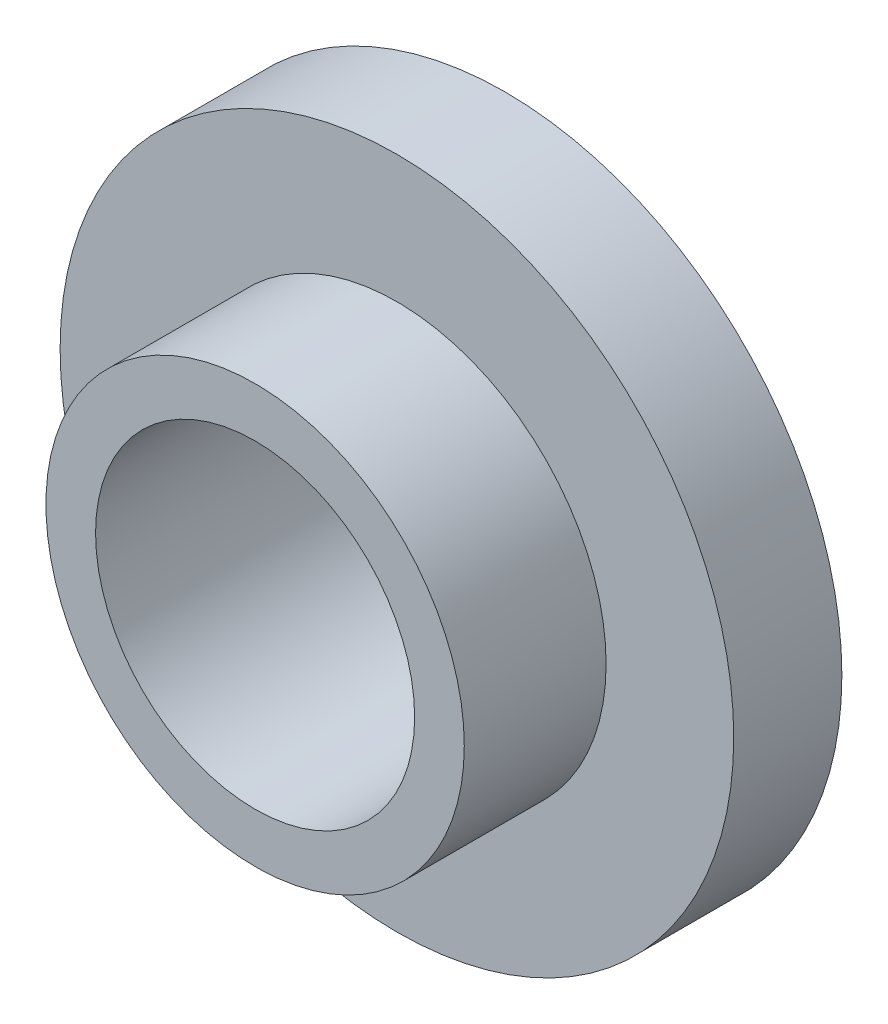
ISO-10303-21;
HEADER;
FILE_DESCRIPTION(('STEP AP214'),'2;1');
FILE_NAME('part.step','',(''),(''),'','','');
FILE_SCHEMA(('AUTOMOTIVE_DESIGN { 1 0 10303 214 1 1 1 1 }'));
ENDSEC;
DATA;
#1=APPLICATION_CONTEXT('core data for automotive mechanical design processes');
#2=APPLICATION_PROTOCOL_DEFINITION('international standard','automotive_design',2000,#1);
#3=PRODUCT_CONTEXT('',#1,'mechanical');
#4=PRODUCT('Part','Part','',(#3));
#5=PRODUCT_RELATED_PRODUCT_CATEGORY('part','',(#4));
#6=PRODUCT_DEFINITION_FORMATION('','',#4);
#7=PRODUCT_DEFINITION_CONTEXT('part definition',#1,'design');
#8=PRODUCT_DEFINITION('design','',#6,#7);
#9=PRODUCT_DEFINITION_SHAPE('','',#8);
#10=(LENGTH_UNIT() NAMED_UNIT(*) SI_UNIT(.MILLI.,.METRE.));
#11=(NAMED_UNIT(*) PLANE_ANGLE_UNIT() SI_UNIT($,.RADIAN.));
#12=(NAMED_UNIT(*) SI_UNIT($,.STERADIAN.) SOLID_ANGLE_UNIT());
#13=UNCERTAINTY_MEASURE_WITH_UNIT(LENGTH_MEASURE(1.E-05),#10,'distance_accuracy_value','');
#14=(GEOMETRIC_REPRESENTATION_CONTEXT(3) GLOBAL_UNCERTAINTY_ASSIGNED_CONTEXT((#13)) GLOBAL_UNIT_ASSIGNED_CONTEXT((#10,
#11,#12)) REPRESENTATION_CONTEXT('',''));
#15=CARTESIAN_POINT('',(0.,0.,0.));
#16=DIRECTION('',(0.,0.,1.));
#17=DIRECTION('',(1.,0.,0.));
#18=AXIS2_PLACEMENT_3D('',#15,#16,#17);
#19=CARTESIAN_POINT('',(0.,0.,4.));
#20=DIRECTION('',(0.,0.,-1.));
#21=DIRECTION('',(-1.,0.,0.));
#22=AXIS2_PLACEMENT_3D('',#19,#20,#21);
#23=CYLINDRICAL_SURFACE('',#22,4.5);
#24=CARTESIAN_POINT('',(0.,0.,4.));
#25=DIRECTION('',(0.,0.,1.));
#26=DIRECTION('',(1.,0.,0.));
#27=AXIS2_PLACEMENT_3D('',#24,#25,#26);
#28=CIRCLE('',#27,4.5);
#29=CARTESIAN_POINT('',(4.5,0.,4.));
#30=VERTEX_POINT('',#29);
#31=EDGE_CURVE('E53',#30,#30,#28,.T.);
#32=ORIENTED_EDGE('',*,*,#31,.T.);
#33=EDGE_LOOP('',(#32));
#34=FACE_BOUND('',#33,.T.);
#35=CARTESIAN_POINT('',(0.,0.,-3.05));
#36=DIRECTION('',(0.,0.,-1.));
#37=DIRECTION('',(-1.,0.,0.));
#38=AXIS2_PLACEMENT_3D('',#35,#36,#37);
#39=CIRCLE('',#38,4.5);
#40=CARTESIAN_POINT('',(-4.5,0.,-3.05));
#41=VERTEX_POINT('',#40);
#42=EDGE_CURVE('E62',#41,#41,#39,.T.);
#43=ORIENTED_EDGE('',*,*,#42,.T.);
#44=EDGE_LOOP('',(#43));
#45=FACE_BOUND('',#44,.T.);
#46=ADVANCED_FACE('F45',(#34,#45),#23,.F.);
#47=CARTESIAN_POINT('',(0.,0.,-4.));
#48=DIRECTION('',(0.,0.,1.));
#49=DIRECTION('',(1.,0.,0.));
#50=AXIS2_PLACEMENT_3D('',#47,#48,#49);
#51=CYLINDRICAL_SURFACE('',#50,9.5);
#52=CARTESIAN_POINT('',(0.,0.,0.));
#53=DIRECTION('',(0.,0.,-1.));
#54=DIRECTION('',(-1.,0.,0.));
#55=AXIS2_PLACEMENT_3D('',#52,#53,#54);
#56=CIRCLE('',#55,9.5);
#57=CARTESIAN_POINT('',(-9.5,0.,0.));
#58=VERTEX_POINT('',#57);
#59=EDGE_CURVE('E59',#58,#58,#56,.T.);
#60=ORIENTED_EDGE('',*,*,#59,.T.);
#61=EDGE_LOOP('',(#60));
#62=FACE_BOUND('',#61,.T.);
#63=CARTESIAN_POINT('',(0.,0.,-3.05));
#64=DIRECTION('',(0.,0.,-1.));
#65=DIRECTION('',(-1.,0.,0.));
#66=AXIS2_PLACEMENT_3D('',#63,#64,#65);
#67=CIRCLE('',#66,9.5);
#68=CARTESIAN_POINT('',(-9.5,0.,-3.05));
#69=VERTEX_POINT('',#68);
#70=EDGE_CURVE('E65',#69,#69,#67,.T.);
#71=ORIENTED_EDGE('',*,*,#70,.F.);
#72=EDGE_LOOP('',(#71));
#73=FACE_BOUND('',#72,.T.);
#74=ADVANCED_FACE('F71',(#62,#73),#51,.T.);
#75=CARTESIAN_POINT('',(0.,0.,4.));
#76=DIRECTION('',(0.,0.,1.));
#77=DIRECTION('',(1.,0.,0.));
#78=AXIS2_PLACEMENT_3D('',#75,#76,#77);
#79=PLANE('',#78);
#80=CARTESIAN_POINT('',(0.,0.,4.));
#81=DIRECTION('',(0.,0.,1.));
#82=DIRECTION('',(1.,0.,0.));
#83=AXIS2_PLACEMENT_3D('',#80,#81,#82);
#84=CIRCLE('',#83,5.9);
#85=CARTESIAN_POINT('',(5.9,0.,4.));
#86=VERTEX_POINT('',#85);
#87=EDGE_CURVE('E11',#86,#86,#84,.T.);
#88=ORIENTED_EDGE('',*,*,#87,.T.);
#89=EDGE_LOOP('',(#88));
#90=FACE_BOUND('',#89,.T.);
#91=ORIENTED_EDGE('',*,*,#31,.F.);
#92=EDGE_LOOP('',(#91));
#93=FACE_BOUND('',#92,.T.);
#94=ADVANCED_FACE('F73',(#90,#93),#79,.T.);
#95=CARTESIAN_POINT('',(0.,0.,4.));
#96=DIRECTION('',(0.,0.,-1.));
#97=DIRECTION('',(-1.,0.,0.));
#98=AXIS2_PLACEMENT_3D('',#95,#96,#97);
#99=CYLINDRICAL_SURFACE('',#98,5.9);
#100=ORIENTED_EDGE('',*,*,#87,.F.);
#101=EDGE_LOOP('',(#100));
#102=FACE_BOUND('',#101,.T.);
#103=CARTESIAN_POINT('',(0.,0.,0.));
#104=DIRECTION('',(0.,0.,1.));
#105=DIRECTION('',(1.,0.,0.));
#106=AXIS2_PLACEMENT_3D('',#103,#104,#105);
#107=CIRCLE('',#106,5.9);
#108=CARTESIAN_POINT('',(5.9,0.,0.));
#109=VERTEX_POINT('',#108);
#110=EDGE_CURVE('E49',#109,#109,#107,.T.);
#111=ORIENTED_EDGE('',*,*,#110,.T.);
#112=EDGE_LOOP('',(#111));
#113=FACE_BOUND('',#112,.T.);
#114=ADVANCED_FACE('F47',(#102,#113),#99,.T.);
#115=CARTESIAN_POINT('',(0.,0.,0.));
#116=DIRECTION('',(0.,0.,-1.));
#117=DIRECTION('',(-1.,0.,0.));
#118=AXIS2_PLACEMENT_3D('',#115,#116,#117);
#119=PLANE('',#118);
#120=ORIENTED_EDGE('',*,*,#110,.F.);
#121=EDGE_LOOP('',(#120));
#122=FACE_BOUND('',#121,.T.);
#123=ORIENTED_EDGE('',*,*,#59,.F.);
#124=EDGE_LOOP('',(#123));
#125=FACE_BOUND('',#124,.T.);
#126=ADVANCED_FACE('F83',(#122,#125),#119,.F.);
#127=CARTESIAN_POINT('',(0.,0.,-3.05));
#128=DIRECTION('',(0.,0.,-1.));
#129=DIRECTION('',(-1.,0.,0.));
#130=AXIS2_PLACEMENT_3D('',#127,#128,#129);
#131=PLANE('',#130);
#132=ORIENTED_EDGE('',*,*,#42,.F.);
#133=EDGE_LOOP('',(#132));
#134=FACE_BOUND('',#133,.T.);
#135=ORIENTED_EDGE('',*,*,#70,.T.);
#136=EDGE_LOOP('',(#135));
#137=FACE_BOUND('',#136,.T.);
#138=ADVANCED_FACE('F69',(#134,#137),#131,.T.);
#139=CLOSED_SHELL('',(#46,#74,#94,#114,#126,#138));
#140=MANIFOLD_SOLID_BREP('B2',#139);
#141=ADVANCED_BREP_SHAPE_REPRESENTATION('',(#18,#140),#14);
#142=SHAPE_DEFINITION_REPRESENTATION(#9,#141);
ENDSEC;
END-ISO-10303-21;
